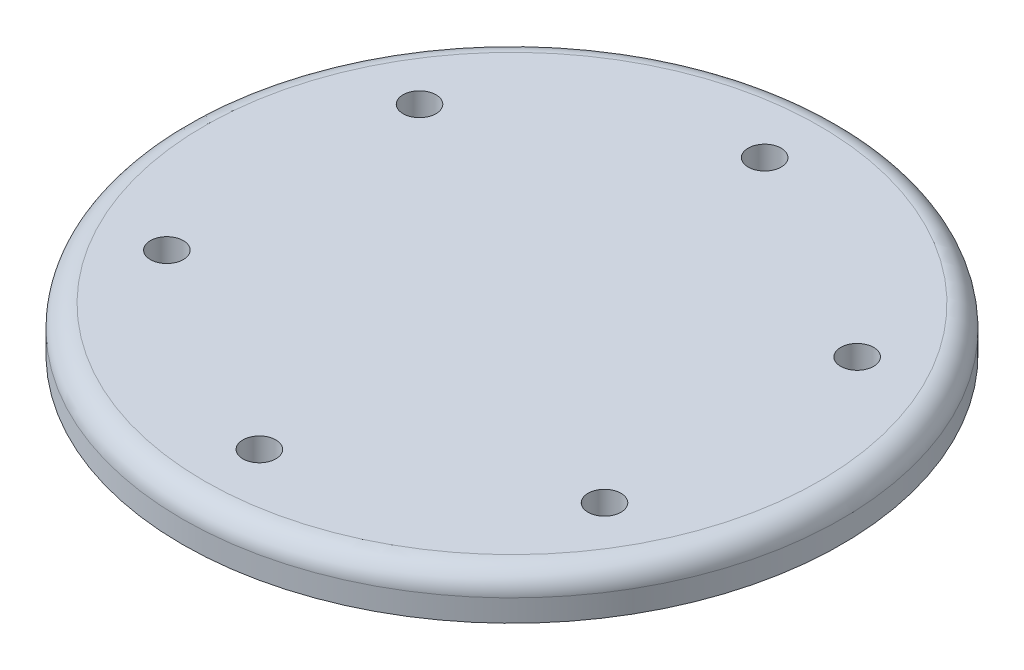
ISO-10303-21;
HEADER;
FILE_DESCRIPTION(('STEP AP214'),'2;1');
FILE_NAME('part.step','',(''),(''),'','','');
FILE_SCHEMA(('AUTOMOTIVE_DESIGN { 1 0 10303 214 1 1 1 1 }'));
ENDSEC;
DATA;
#1=APPLICATION_CONTEXT('core data for automotive mechanical design processes');
#2=APPLICATION_PROTOCOL_DEFINITION('international standard','automotive_design',2000,#1);
#3=PRODUCT_CONTEXT('',#1,'mechanical');
#4=PRODUCT('Part','Part','',(#3));
#5=PRODUCT_RELATED_PRODUCT_CATEGORY('part','',(#4));
#6=PRODUCT_DEFINITION_FORMATION('','',#4);
#7=PRODUCT_DEFINITION_CONTEXT('part definition',#1,'design');
#8=PRODUCT_DEFINITION('design','',#6,#7);
#9=PRODUCT_DEFINITION_SHAPE('','',#8);
#10=(LENGTH_UNIT() NAMED_UNIT(*) SI_UNIT(.MILLI.,.METRE.));
#11=(NAMED_UNIT(*) PLANE_ANGLE_UNIT() SI_UNIT($,.RADIAN.));
#12=(NAMED_UNIT(*) SI_UNIT($,.STERADIAN.) SOLID_ANGLE_UNIT());
#13=UNCERTAINTY_MEASURE_WITH_UNIT(LENGTH_MEASURE(1.E-05),#10,'distance_accuracy_value','');
#14=(GEOMETRIC_REPRESENTATION_CONTEXT(3) GLOBAL_UNCERTAINTY_ASSIGNED_CONTEXT((#13)) GLOBAL_UNIT_ASSIGNED_CONTEXT((#10,
#11,#12)) REPRESENTATION_CONTEXT('',''));
#15=CARTESIAN_POINT('',(0.,0.,0.));
#16=DIRECTION('',(0.,0.,1.));
#17=DIRECTION('',(1.,0.,0.));
#18=AXIS2_PLACEMENT_3D('',#15,#16,#17);
#19=CARTESIAN_POINT('',(0.,4.,0.));
#20=DIRECTION('',(0.,1.,0.));
#21=DIRECTION('',(0.,0.,1.));
#22=AXIS2_PLACEMENT_3D('',#19,#20,#21);
#23=PLANE('',#22);
#24=CARTESIAN_POINT('',(0.,4.,0.));
#25=DIRECTION('',(0.,1.,0.));
#26=DIRECTION('',(0.,0.,1.));
#27=AXIS2_PLACEMENT_3D('',#24,#25,#26);
#28=CIRCLE('',#27,28.);
#29=CARTESIAN_POINT('',(0.,4.,28.));
#30=VERTEX_POINT('',#29);
#31=EDGE_CURVE('E38',#30,#30,#28,.T.);
#32=ORIENTED_EDGE('',*,*,#31,.T.);
#33=EDGE_LOOP('',(#32));
#34=FACE_BOUND('',#33,.T.);
#35=CARTESIAN_POINT('',(-19.9170842870407,4.,11.5008660254045));
#36=DIRECTION('',(0.,1.,0.));
#37=DIRECTION('',(0.,0.,1.));
#38=AXIS2_PLACEMENT_3D('',#35,#36,#37);
#39=CIRCLE('',#38,1.5);
#40=CARTESIAN_POINT('',(-19.9170842870407,4.,13.0008660254045));
#41=VERTEX_POINT('',#40);
#42=EDGE_CURVE('E70',#41,#41,#39,.T.);
#43=ORIENTED_EDGE('',*,*,#42,.F.);
#44=EDGE_LOOP('',(#43));
#45=FACE_BOUND('',#44,.T.);
#46=CARTESIAN_POINT('',(19.9200842870435,4.,11.4991339745955));
#47=DIRECTION('',(0.,1.,0.));
#48=DIRECTION('',(0.,0.,1.));
#49=AXIS2_PLACEMENT_3D('',#46,#47,#48);
#50=CIRCLE('',#49,1.5);
#51=CARTESIAN_POINT('',(19.9200842870435,4.,12.9991339745955));
#52=VERTEX_POINT('',#51);
#53=EDGE_CURVE('E58',#52,#52,#50,.T.);
#54=ORIENTED_EDGE('',*,*,#53,.F.);
#55=EDGE_LOOP('',(#54));
#56=FACE_BOUND('',#55,.T.);
#57=CARTESIAN_POINT('',(0.,4.,-23.));
#58=DIRECTION('',(0.,1.,0.));
#59=DIRECTION('',(0.,0.,1.));
#60=AXIS2_PLACEMENT_3D('',#57,#58,#59);
#61=CIRCLE('',#60,1.5);
#62=CARTESIAN_POINT('',(0.,4.,-21.5));
#63=VERTEX_POINT('',#62);
#64=EDGE_CURVE('E46',#63,#63,#61,.T.);
#65=ORIENTED_EDGE('',*,*,#64,.F.);
#66=EDGE_LOOP('',(#65));
#67=FACE_BOUND('',#66,.T.);
#68=CARTESIAN_POINT('',(19.9190842870426,4.,-11.5008660254046));
#69=DIRECTION('',(0.,1.,0.));
#70=DIRECTION('',(0.,0.,1.));
#71=AXIS2_PLACEMENT_3D('',#68,#69,#70);
#72=CIRCLE('',#71,1.50000000000001);
#73=CARTESIAN_POINT('',(19.9190842870426,4.,-10.0008660254046));
#74=VERTEX_POINT('',#73);
#75=EDGE_CURVE('E52',#74,#74,#72,.T.);
#76=ORIENTED_EDGE('',*,*,#75,.F.);
#77=EDGE_LOOP('',(#76));
#78=FACE_BOUND('',#77,.T.);
#79=CARTESIAN_POINT('',(0.00200000000179425,4.,23.));
#80=DIRECTION('',(0.,1.,0.));
#81=DIRECTION('',(0.,0.,1.));
#82=AXIS2_PLACEMENT_3D('',#79,#80,#81);
#83=CIRCLE('',#82,1.5);
#84=CARTESIAN_POINT('',(0.00200000000179425,4.,24.5));
#85=VERTEX_POINT('',#84);
#86=EDGE_CURVE('E64',#85,#85,#83,.T.);
#87=ORIENTED_EDGE('',*,*,#86,.F.);
#88=EDGE_LOOP('',(#87));
#89=FACE_BOUND('',#88,.T.);
#90=CARTESIAN_POINT('',(-19.9180842870415,4.,-11.4991339745956));
#91=DIRECTION('',(0.,1.,0.));
#92=DIRECTION('',(0.,0.,1.));
#93=AXIS2_PLACEMENT_3D('',#90,#91,#92);
#94=CIRCLE('',#93,1.5);
#95=CARTESIAN_POINT('',(-19.9180842870415,4.,-9.9991339745956));
#96=VERTEX_POINT('',#95);
#97=EDGE_CURVE('E76',#96,#96,#94,.T.);
#98=ORIENTED_EDGE('',*,*,#97,.F.);
#99=EDGE_LOOP('',(#98));
#100=FACE_BOUND('',#99,.T.);
#101=ADVANCED_FACE('F31',(#34,#45,#56,#67,#78,#89,#100),#23,.T.);
#102=CARTESIAN_POINT('',(0.,0.,0.));
#103=DIRECTION('',(0.,1.,0.));
#104=DIRECTION('',(0.,0.,1.));
#105=AXIS2_PLACEMENT_3D('',#102,#103,#104);
#106=PLANE('',#105);
#107=CARTESIAN_POINT('',(0.,0.,0.));
#108=DIRECTION('',(0.,1.,0.));
#109=DIRECTION('',(0.,0.,1.));
#110=AXIS2_PLACEMENT_3D('',#107,#108,#109);
#111=CIRCLE('',#110,30.);
#112=CARTESIAN_POINT('',(0.,0.,30.));
#113=VERTEX_POINT('',#112);
#114=EDGE_CURVE('E42',#113,#113,#111,.T.);
#115=ORIENTED_EDGE('',*,*,#114,.F.);
#116=EDGE_LOOP('',(#115));
#117=FACE_BOUND('',#116,.T.);
#118=CARTESIAN_POINT('',(0.,0.,-23.));
#119=DIRECTION('',(0.,1.,0.));
#120=DIRECTION('',(0.,0.,1.));
#121=AXIS2_PLACEMENT_3D('',#118,#119,#120);
#122=CIRCLE('',#121,1.5);
#123=CARTESIAN_POINT('',(0.,0.,-21.5));
#124=VERTEX_POINT('',#123);
#125=EDGE_CURVE('E49',#124,#124,#122,.T.);
#126=ORIENTED_EDGE('',*,*,#125,.T.);
#127=EDGE_LOOP('',(#126));
#128=FACE_BOUND('',#127,.T.);
#129=CARTESIAN_POINT('',(19.9190842870426,0.,-11.5008660254046));
#130=DIRECTION('',(0.,1.,0.));
#131=DIRECTION('',(0.,0.,1.));
#132=AXIS2_PLACEMENT_3D('',#129,#130,#131);
#133=CIRCLE('',#132,1.50000000000001);
#134=CARTESIAN_POINT('',(19.9190842870426,0.,-10.0008660254046));
#135=VERTEX_POINT('',#134);
#136=EDGE_CURVE('E55',#135,#135,#133,.T.);
#137=ORIENTED_EDGE('',*,*,#136,.T.);
#138=EDGE_LOOP('',(#137));
#139=FACE_BOUND('',#138,.T.);
#140=CARTESIAN_POINT('',(19.9200842870435,0.,11.4991339745955));
#141=DIRECTION('',(0.,1.,0.));
#142=DIRECTION('',(0.,0.,1.));
#143=AXIS2_PLACEMENT_3D('',#140,#141,#142);
#144=CIRCLE('',#143,1.5);
#145=CARTESIAN_POINT('',(19.9200842870435,0.,12.9991339745955));
#146=VERTEX_POINT('',#145);
#147=EDGE_CURVE('E61',#146,#146,#144,.T.);
#148=ORIENTED_EDGE('',*,*,#147,.T.);
#149=EDGE_LOOP('',(#148));
#150=FACE_BOUND('',#149,.T.);
#151=CARTESIAN_POINT('',(0.00200000000179425,0.,23.));
#152=DIRECTION('',(0.,1.,0.));
#153=DIRECTION('',(0.,0.,1.));
#154=AXIS2_PLACEMENT_3D('',#151,#152,#153);
#155=CIRCLE('',#154,1.5);
#156=CARTESIAN_POINT('',(0.00200000000179425,0.,24.5));
#157=VERTEX_POINT('',#156);
#158=EDGE_CURVE('E67',#157,#157,#155,.T.);
#159=ORIENTED_EDGE('',*,*,#158,.T.);
#160=EDGE_LOOP('',(#159));
#161=FACE_BOUND('',#160,.T.);
#162=CARTESIAN_POINT('',(-19.9170842870407,0.,11.5008660254045));
#163=DIRECTION('',(0.,1.,0.));
#164=DIRECTION('',(0.,0.,1.));
#165=AXIS2_PLACEMENT_3D('',#162,#163,#164);
#166=CIRCLE('',#165,1.5);
#167=CARTESIAN_POINT('',(-19.9170842870407,0.,13.0008660254045));
#168=VERTEX_POINT('',#167);
#169=EDGE_CURVE('E73',#168,#168,#166,.T.);
#170=ORIENTED_EDGE('',*,*,#169,.T.);
#171=EDGE_LOOP('',(#170));
#172=FACE_BOUND('',#171,.T.);
#173=CARTESIAN_POINT('',(-19.9180842870415,0.,-11.4991339745956));
#174=DIRECTION('',(0.,1.,0.));
#175=DIRECTION('',(0.,0.,1.));
#176=AXIS2_PLACEMENT_3D('',#173,#174,#175);
#177=CIRCLE('',#176,1.5);
#178=CARTESIAN_POINT('',(-19.9180842870415,0.,-9.9991339745956));
#179=VERTEX_POINT('',#178);
#180=EDGE_CURVE('E79',#179,#179,#177,.T.);
#181=ORIENTED_EDGE('',*,*,#180,.T.);
#182=EDGE_LOOP('',(#181));
#183=FACE_BOUND('',#182,.T.);
#184=ADVANCED_FACE('F89',(#117,#128,#139,#150,#161,#172,#183),#106,.F.);
#185=CARTESIAN_POINT('',(0.,4.,0.));
#186=DIRECTION('',(0.,-1.,0.));
#187=DIRECTION('',(0.,0.,-1.));
#188=AXIS2_PLACEMENT_3D('',#185,#186,#187);
#189=CYLINDRICAL_SURFACE('',#188,30.);
#190=CARTESIAN_POINT('',(0.,2.,0.));
#191=DIRECTION('',(0.,1.,0.));
#192=DIRECTION('',(0.,0.,1.));
#193=AXIS2_PLACEMENT_3D('',#190,#191,#192);
#194=CIRCLE('',#193,30.);
#195=CARTESIAN_POINT('',(0.,2.,30.));
#196=VERTEX_POINT('',#195);
#197=EDGE_CURVE('E10',#196,#196,#194,.F.);
#198=ORIENTED_EDGE('',*,*,#197,.T.);
#199=EDGE_LOOP('',(#198));
#200=FACE_BOUND('',#199,.T.);
#201=ORIENTED_EDGE('',*,*,#114,.T.);
#202=EDGE_LOOP('',(#201));
#203=FACE_BOUND('',#202,.T.);
#204=ADVANCED_FACE('F94',(#200,#203),#189,.T.);
#205=CARTESIAN_POINT('',(0.,4.,-23.));
#206=DIRECTION('',(0.,-1.,0.));
#207=DIRECTION('',(0.,0.,-1.));
#208=AXIS2_PLACEMENT_3D('',#205,#206,#207);
#209=CYLINDRICAL_SURFACE('',#208,1.5);
#210=ORIENTED_EDGE('',*,*,#64,.T.);
#211=EDGE_LOOP('',(#210));
#212=FACE_BOUND('',#211,.T.);
#213=ORIENTED_EDGE('',*,*,#125,.F.);
#214=EDGE_LOOP('',(#213));
#215=FACE_BOUND('',#214,.T.);
#216=ADVANCED_FACE('F99',(#212,#215),#209,.F.);
#217=CARTESIAN_POINT('',(19.9190842870426,4.,-11.5008660254046));
#218=DIRECTION('',(0.,-1.,0.));
#219=DIRECTION('',(0.,0.,-1.));
#220=AXIS2_PLACEMENT_3D('',#217,#218,#219);
#221=CYLINDRICAL_SURFACE('',#220,1.50000000000001);
#222=ORIENTED_EDGE('',*,*,#75,.T.);
#223=EDGE_LOOP('',(#222));
#224=FACE_BOUND('',#223,.T.);
#225=ORIENTED_EDGE('',*,*,#136,.F.);
#226=EDGE_LOOP('',(#225));
#227=FACE_BOUND('',#226,.T.);
#228=ADVANCED_FACE('F105',(#224,#227),#221,.F.);
#229=CARTESIAN_POINT('',(19.9200842870435,4.,11.4991339745955));
#230=DIRECTION('',(0.,-1.,0.));
#231=DIRECTION('',(0.,0.,-1.));
#232=AXIS2_PLACEMENT_3D('',#229,#230,#231);
#233=CYLINDRICAL_SURFACE('',#232,1.5);
#234=ORIENTED_EDGE('',*,*,#53,.T.);
#235=EDGE_LOOP('',(#234));
#236=FACE_BOUND('',#235,.T.);
#237=ORIENTED_EDGE('',*,*,#147,.F.);
#238=EDGE_LOOP('',(#237));
#239=FACE_BOUND('',#238,.T.);
#240=ADVANCED_FACE('F135',(#236,#239),#233,.F.);
#241=CARTESIAN_POINT('',(0.00200000000179425,4.,23.));
#242=DIRECTION('',(0.,-1.,0.));
#243=DIRECTION('',(0.,0.,-1.));
#244=AXIS2_PLACEMENT_3D('',#241,#242,#243);
#245=CYLINDRICAL_SURFACE('',#244,1.5);
#246=ORIENTED_EDGE('',*,*,#86,.T.);
#247=EDGE_LOOP('',(#246));
#248=FACE_BOUND('',#247,.T.);
#249=ORIENTED_EDGE('',*,*,#158,.F.);
#250=EDGE_LOOP('',(#249));
#251=FACE_BOUND('',#250,.T.);
#252=ADVANCED_FACE('F129',(#248,#251),#245,.F.);
#253=CARTESIAN_POINT('',(-19.9170842870407,4.,11.5008660254045));
#254=DIRECTION('',(0.,-1.,0.));
#255=DIRECTION('',(0.,0.,-1.));
#256=AXIS2_PLACEMENT_3D('',#253,#254,#255);
#257=CYLINDRICAL_SURFACE('',#256,1.5);
#258=ORIENTED_EDGE('',*,*,#42,.T.);
#259=EDGE_LOOP('',(#258));
#260=FACE_BOUND('',#259,.T.);
#261=ORIENTED_EDGE('',*,*,#169,.F.);
#262=EDGE_LOOP('',(#261));
#263=FACE_BOUND('',#262,.T.);
#264=ADVANCED_FACE('F122',(#260,#263),#257,.F.);
#265=CARTESIAN_POINT('',(-19.9180842870415,4.,-11.4991339745956));
#266=DIRECTION('',(0.,-1.,0.));
#267=DIRECTION('',(0.,0.,-1.));
#268=AXIS2_PLACEMENT_3D('',#265,#266,#267);
#269=CYLINDRICAL_SURFACE('',#268,1.5);
#270=ORIENTED_EDGE('',*,*,#97,.T.);
#271=EDGE_LOOP('',(#270));
#272=FACE_BOUND('',#271,.T.);
#273=ORIENTED_EDGE('',*,*,#180,.F.);
#274=EDGE_LOOP('',(#273));
#275=FACE_BOUND('',#274,.T.);
#276=ADVANCED_FACE('F85',(#272,#275),#269,.F.);
#277=CARTESIAN_POINT('',(0.,2.,0.));
#278=DIRECTION('',(0.,1.,0.));
#279=DIRECTION('',(0.,0.,1.));
#280=AXIS2_PLACEMENT_3D('',#277,#278,#279);
#281=TOROIDAL_SURFACE('',#280,28.,2.);
#282=ORIENTED_EDGE('',*,*,#197,.F.);
#283=EDGE_LOOP('',(#282));
#284=FACE_BOUND('',#283,.T.);
#285=ORIENTED_EDGE('',*,*,#31,.F.);
#286=EDGE_LOOP('',(#285));
#287=FACE_BOUND('',#286,.T.);
#288=ADVANCED_FACE('F33',(#284,#287),#281,.T.);
#289=CLOSED_SHELL('',(#101,#184,#204,#216,#228,#240,#252,#264,#276,#288));
#290=MANIFOLD_SOLID_BREP('B2',#289);
#291=ADVANCED_BREP_SHAPE_REPRESENTATION('',(#18,#290),#14);
#292=SHAPE_DEFINITION_REPRESENTATION(#9,#291);
ENDSEC;
END-ISO-10303-21;
